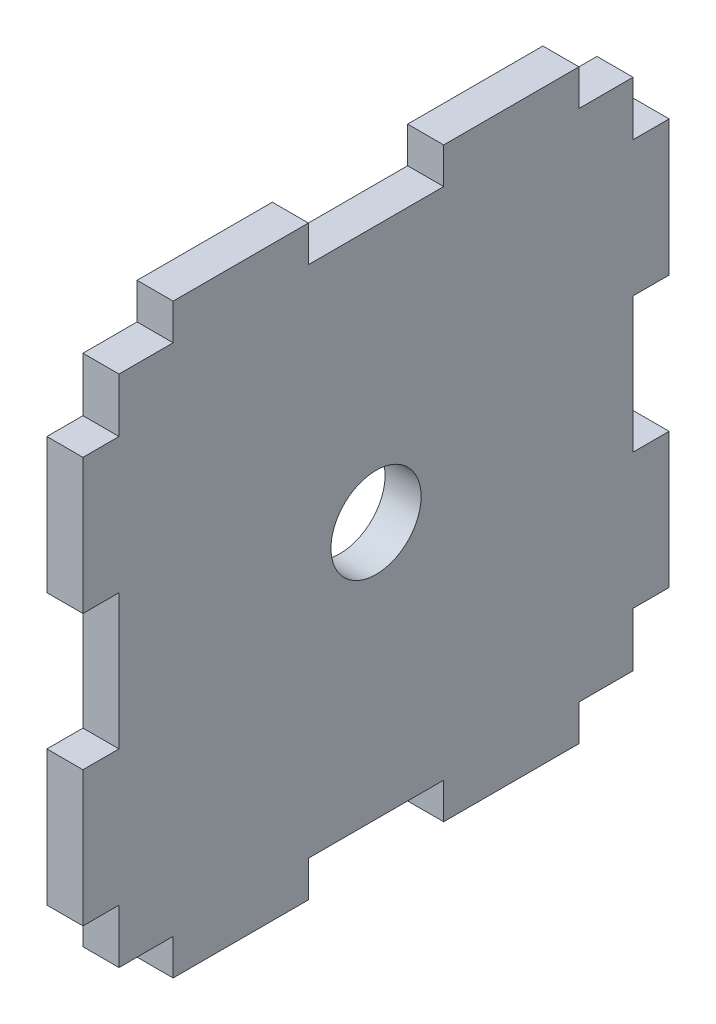
ISO-10303-21;
HEADER;
FILE_DESCRIPTION(('STEP AP214'),'2;1');
FILE_NAME('part.step','',(''),(''),'','','');
FILE_SCHEMA(('AUTOMOTIVE_DESIGN { 1 0 10303 214 1 1 1 1 }'));
ENDSEC;
DATA;
#1=APPLICATION_CONTEXT('core data for automotive mechanical design processes');
#2=APPLICATION_PROTOCOL_DEFINITION('international standard','automotive_design',2000,#1);
#3=PRODUCT_CONTEXT('',#1,'mechanical');
#4=PRODUCT('Part','Part','',(#3));
#5=PRODUCT_RELATED_PRODUCT_CATEGORY('part','',(#4));
#6=PRODUCT_DEFINITION_FORMATION('','',#4);
#7=PRODUCT_DEFINITION_CONTEXT('part definition',#1,'design');
#8=PRODUCT_DEFINITION('design','',#6,#7);
#9=PRODUCT_DEFINITION_SHAPE('','',#8);
#10=(LENGTH_UNIT() NAMED_UNIT(*) SI_UNIT(.MILLI.,.METRE.));
#11=(NAMED_UNIT(*) PLANE_ANGLE_UNIT() SI_UNIT($,.RADIAN.));
#12=(NAMED_UNIT(*) SI_UNIT($,.STERADIAN.) SOLID_ANGLE_UNIT());
#13=UNCERTAINTY_MEASURE_WITH_UNIT(LENGTH_MEASURE(1.E-05),#10,'distance_accuracy_value','');
#14=(GEOMETRIC_REPRESENTATION_CONTEXT(3) GLOBAL_UNCERTAINTY_ASSIGNED_CONTEXT((#13)) GLOBAL_UNIT_ASSIGNED_CONTEXT((#10,
#11,#12)) REPRESENTATION_CONTEXT('',''));
#15=CARTESIAN_POINT('',(0.,0.,0.));
#16=DIRECTION('',(0.,0.,1.));
#17=DIRECTION('',(1.,0.,0.));
#18=AXIS2_PLACEMENT_3D('',#15,#16,#17);
#19=CARTESIAN_POINT('',(4.,0.,0.));
#20=DIRECTION('',(0.,0.,-1.));
#21=DIRECTION('',(-1.,0.,0.));
#22=AXIS2_PLACEMENT_3D('',#19,#20,#21);
#23=PLANE('',#22);
#24=DIRECTION('',(0.,-1.,0.));
#25=VECTOR('',#24,1.);
#26=CARTESIAN_POINT('',(0.,0.,0.));
#27=LINE('',#26,#25);
#28=CARTESIAN_POINT('',(0.,25.,0.));
#29=VERTEX_POINT('',#28);
#30=CARTESIAN_POINT('',(0.,10.,0.));
#31=VERTEX_POINT('',#30);
#32=EDGE_CURVE('E518',#29,#31,#27,.T.);
#33=ORIENTED_EDGE('',*,*,#32,.T.);
#34=DIRECTION('',(1.,0.,0.));
#35=VECTOR('',#34,1.);
#36=CARTESIAN_POINT('',(0.,10.,0.));
#37=LINE('',#36,#35);
#38=CARTESIAN_POINT('',(4.,10.,0.));
#39=VERTEX_POINT('',#38);
#40=EDGE_CURVE('E299',#31,#39,#37,.T.);
#41=ORIENTED_EDGE('',*,*,#40,.T.);
#42=DIRECTION('',(0.,-1.,0.));
#43=VECTOR('',#42,1.);
#44=CARTESIAN_POINT('',(4.,0.,0.));
#45=LINE('',#44,#43);
#46=CARTESIAN_POINT('',(4.,25.,0.));
#47=VERTEX_POINT('',#46);
#48=EDGE_CURVE('E521',#47,#39,#45,.T.);
#49=ORIENTED_EDGE('',*,*,#48,.F.);
#50=DIRECTION('',(1.,0.,0.));
#51=VECTOR('',#50,1.);
#52=CARTESIAN_POINT('',(0.,25.,0.));
#53=LINE('',#52,#51);
#54=EDGE_CURVE('E304',#29,#47,#53,.T.);
#55=ORIENTED_EDGE('',*,*,#54,.F.);
#56=EDGE_LOOP('',(#33,#41,#49,#55));
#57=FACE_BOUND('',#56,.T.);
#58=ADVANCED_FACE('F35',(#57),#23,.F.);
#59=CARTESIAN_POINT('',(4.,0.,-65.));
#60=DIRECTION('',(0.,0.,1.));
#61=DIRECTION('',(1.,0.,0.));
#62=AXIS2_PLACEMENT_3D('',#59,#60,#61);
#63=PLANE('',#62);
#64=DIRECTION('',(0.,1.,0.));
#65=VECTOR('',#64,1.);
#66=CARTESIAN_POINT('',(0.,0.,-65.));
#67=LINE('',#66,#65);
#68=CARTESIAN_POINT('',(0.,40.,-65.));
#69=VERTEX_POINT('',#68);
#70=CARTESIAN_POINT('',(0.,55.,-65.));
#71=VERTEX_POINT('',#70);
#72=EDGE_CURVE('E541',#69,#71,#67,.T.);
#73=ORIENTED_EDGE('',*,*,#72,.T.);
#74=DIRECTION('',(1.,0.,0.));
#75=VECTOR('',#74,1.);
#76=CARTESIAN_POINT('',(0.,55.,-65.));
#77=LINE('',#76,#75);
#78=CARTESIAN_POINT('',(4.,55.,-65.));
#79=VERTEX_POINT('',#78);
#80=EDGE_CURVE('E356',#71,#79,#77,.T.);
#81=ORIENTED_EDGE('',*,*,#80,.T.);
#82=DIRECTION('',(0.,1.,0.));
#83=VECTOR('',#82,1.);
#84=CARTESIAN_POINT('',(4.,0.,-65.));
#85=LINE('',#84,#83);
#86=CARTESIAN_POINT('',(4.,40.,-65.));
#87=VERTEX_POINT('',#86);
#88=EDGE_CURVE('E530',#87,#79,#85,.T.);
#89=ORIENTED_EDGE('',*,*,#88,.F.);
#90=DIRECTION('',(1.,0.,0.));
#91=VECTOR('',#90,1.);
#92=CARTESIAN_POINT('',(0.,40.,-65.));
#93=LINE('',#92,#91);
#94=EDGE_CURVE('E336',#69,#87,#93,.T.);
#95=ORIENTED_EDGE('',*,*,#94,.F.);
#96=EDGE_LOOP('',(#73,#81,#89,#95));
#97=FACE_BOUND('',#96,.T.);
#98=ADVANCED_FACE('F595',(#97),#63,.F.);
#99=CARTESIAN_POINT('',(4.,0.,0.));
#100=DIRECTION('',(0.,1.,0.));
#101=DIRECTION('',(0.,0.,1.));
#102=AXIS2_PLACEMENT_3D('',#99,#100,#101);
#103=PLANE('',#102);
#104=DIRECTION('',(0.,0.,-1.));
#105=VECTOR('',#104,1.);
#106=CARTESIAN_POINT('',(4.,0.,0.));
#107=LINE('',#106,#105);
#108=CARTESIAN_POINT('',(4.,0.,-10.));
#109=VERTEX_POINT('',#108);
#110=CARTESIAN_POINT('',(4.,0.,-25.));
#111=VERTEX_POINT('',#110);
#112=EDGE_CURVE('E529',#109,#111,#107,.T.);
#113=ORIENTED_EDGE('',*,*,#112,.F.);
#114=DIRECTION('',(1.,0.,0.));
#115=VECTOR('',#114,1.);
#116=CARTESIAN_POINT('',(0.,0.,-10.));
#117=LINE('',#116,#115);
#118=CARTESIAN_POINT('',(0.,0.,-10.));
#119=VERTEX_POINT('',#118);
#120=EDGE_CURVE('E493',#119,#109,#117,.T.);
#121=ORIENTED_EDGE('',*,*,#120,.F.);
#122=DIRECTION('',(0.,0.,-1.));
#123=VECTOR('',#122,1.);
#124=CARTESIAN_POINT('',(0.,0.,0.));
#125=LINE('',#124,#123);
#126=CARTESIAN_POINT('',(0.,0.,-25.));
#127=VERTEX_POINT('',#126);
#128=EDGE_CURVE('E540',#119,#127,#125,.T.);
#129=ORIENTED_EDGE('',*,*,#128,.T.);
#130=DIRECTION('',(1.,0.,0.));
#131=VECTOR('',#130,1.);
#132=CARTESIAN_POINT('',(0.,0.,-25.));
#133=LINE('',#132,#131);
#134=EDGE_CURVE('E454',#127,#111,#133,.T.);
#135=ORIENTED_EDGE('',*,*,#134,.T.);
#136=EDGE_LOOP('',(#113,#121,#129,#135));
#137=FACE_BOUND('',#136,.T.);
#138=ADVANCED_FACE('F553',(#137),#103,.F.);
#139=CARTESIAN_POINT('',(4.,65.,0.));
#140=DIRECTION('',(0.,-1.,0.));
#141=DIRECTION('',(0.,0.,-1.));
#142=AXIS2_PLACEMENT_3D('',#139,#140,#141);
#143=PLANE('',#142);
#144=DIRECTION('',(0.,0.,1.));
#145=VECTOR('',#144,1.);
#146=CARTESIAN_POINT('',(4.,65.,0.));
#147=LINE('',#146,#145);
#148=CARTESIAN_POINT('',(4.,65.,-25.));
#149=VERTEX_POINT('',#148);
#150=CARTESIAN_POINT('',(4.,65.,-10.));
#151=VERTEX_POINT('',#150);
#152=EDGE_CURVE('E44',#149,#151,#147,.T.);
#153=ORIENTED_EDGE('',*,*,#152,.F.);
#154=DIRECTION('',(1.,0.,0.));
#155=VECTOR('',#154,1.);
#156=CARTESIAN_POINT('',(0.,65.,-25.));
#157=LINE('',#156,#155);
#158=CARTESIAN_POINT('',(0.,65.,-25.));
#159=VERTEX_POINT('',#158);
#160=EDGE_CURVE('E420',#159,#149,#157,.T.);
#161=ORIENTED_EDGE('',*,*,#160,.F.);
#162=DIRECTION('',(0.,0.,1.));
#163=VECTOR('',#162,1.);
#164=CARTESIAN_POINT('',(0.,65.,0.));
#165=LINE('',#164,#163);
#166=CARTESIAN_POINT('',(0.,65.,-10.));
#167=VERTEX_POINT('',#166);
#168=EDGE_CURVE('E39',#159,#167,#165,.T.);
#169=ORIENTED_EDGE('',*,*,#168,.T.);
#170=DIRECTION('',(1.,0.,0.));
#171=VECTOR('',#170,1.);
#172=CARTESIAN_POINT('',(0.,65.,-10.));
#173=LINE('',#172,#171);
#174=EDGE_CURVE('E509',#167,#151,#173,.T.);
#175=ORIENTED_EDGE('',*,*,#174,.T.);
#176=EDGE_LOOP('',(#153,#161,#169,#175));
#177=FACE_BOUND('',#176,.T.);
#178=ADVANCED_FACE('F603',(#177),#143,.F.);
#179=CARTESIAN_POINT('',(0.,55.,0.));
#180=VERTEX_POINT('',#179);
#181=CARTESIAN_POINT('',(0.,40.,0.));
#182=VERTEX_POINT('',#181);
#183=EDGE_CURVE('E537',#180,#182,#27,.T.);
#184=ORIENTED_EDGE('',*,*,#183,.T.);
#185=DIRECTION('',(1.,0.,0.));
#186=VECTOR('',#185,1.);
#187=CARTESIAN_POINT('',(0.,40.,0.));
#188=LINE('',#187,#186);
#189=CARTESIAN_POINT('',(4.,40.,0.));
#190=VERTEX_POINT('',#189);
#191=EDGE_CURVE('E60',#182,#190,#188,.T.);
#192=ORIENTED_EDGE('',*,*,#191,.T.);
#193=CARTESIAN_POINT('',(4.,55.,0.));
#194=VERTEX_POINT('',#193);
#195=EDGE_CURVE('E524',#194,#190,#45,.T.);
#196=ORIENTED_EDGE('',*,*,#195,.F.);
#197=DIRECTION('',(1.,0.,0.));
#198=VECTOR('',#197,1.);
#199=CARTESIAN_POINT('',(0.,55.,0.));
#200=LINE('',#199,#198);
#201=EDGE_CURVE('E390',#180,#194,#200,.T.);
#202=ORIENTED_EDGE('',*,*,#201,.F.);
#203=EDGE_LOOP('',(#184,#192,#196,#202));
#204=FACE_BOUND('',#203,.T.);
#205=ADVANCED_FACE('F37',(#204),#23,.F.);
#206=CARTESIAN_POINT('',(4.,0.,-40.));
#207=VERTEX_POINT('',#206);
#208=CARTESIAN_POINT('',(4.,0.,-55.));
#209=VERTEX_POINT('',#208);
#210=EDGE_CURVE('E526',#207,#209,#107,.T.);
#211=ORIENTED_EDGE('',*,*,#210,.F.);
#212=DIRECTION('',(1.,0.,0.));
#213=VECTOR('',#212,1.);
#214=CARTESIAN_POINT('',(0.,0.,-40.));
#215=LINE('',#214,#213);
#216=CARTESIAN_POINT('',(0.,0.,-40.));
#217=VERTEX_POINT('',#216);
#218=EDGE_CURVE('E470',#217,#207,#215,.T.);
#219=ORIENTED_EDGE('',*,*,#218,.F.);
#220=CARTESIAN_POINT('',(0.,0.,-55.));
#221=VERTEX_POINT('',#220);
#222=EDGE_CURVE('E538',#217,#221,#125,.T.);
#223=ORIENTED_EDGE('',*,*,#222,.T.);
#224=DIRECTION('',(1.,0.,0.));
#225=VECTOR('',#224,1.);
#226=CARTESIAN_POINT('',(0.,0.,-55.));
#227=LINE('',#226,#225);
#228=EDGE_CURVE('E440',#221,#209,#227,.T.);
#229=ORIENTED_EDGE('',*,*,#228,.T.);
#230=EDGE_LOOP('',(#211,#219,#223,#229));
#231=FACE_BOUND('',#230,.T.);
#232=ADVANCED_FACE('F602',(#231),#103,.F.);
#233=CARTESIAN_POINT('',(0.,10.,-65.));
#234=VERTEX_POINT('',#233);
#235=CARTESIAN_POINT('',(0.,25.,-65.));
#236=VERTEX_POINT('',#235);
#237=EDGE_CURVE('E543',#234,#236,#67,.T.);
#238=ORIENTED_EDGE('',*,*,#237,.T.);
#239=DIRECTION('',(1.,0.,0.));
#240=VECTOR('',#239,1.);
#241=CARTESIAN_POINT('',(0.,25.,-65.));
#242=LINE('',#241,#240);
#243=CARTESIAN_POINT('',(4.,25.,-65.));
#244=VERTEX_POINT('',#243);
#245=EDGE_CURVE('E361',#236,#244,#242,.T.);
#246=ORIENTED_EDGE('',*,*,#245,.T.);
#247=CARTESIAN_POINT('',(4.,10.,-65.));
#248=VERTEX_POINT('',#247);
#249=EDGE_CURVE('E532',#248,#244,#85,.T.);
#250=ORIENTED_EDGE('',*,*,#249,.F.);
#251=DIRECTION('',(1.,0.,0.));
#252=VECTOR('',#251,1.);
#253=CARTESIAN_POINT('',(0.,10.,-65.));
#254=LINE('',#253,#252);
#255=EDGE_CURVE('E318',#234,#248,#254,.T.);
#256=ORIENTED_EDGE('',*,*,#255,.F.);
#257=EDGE_LOOP('',(#238,#246,#250,#256));
#258=FACE_BOUND('',#257,.T.);
#259=ADVANCED_FACE('F600',(#258),#63,.F.);
#260=CARTESIAN_POINT('',(4.,65.,-55.));
#261=VERTEX_POINT('',#260);
#262=CARTESIAN_POINT('',(4.,65.,-40.));
#263=VERTEX_POINT('',#262);
#264=EDGE_CURVE('E11',#261,#263,#147,.T.);
#265=ORIENTED_EDGE('',*,*,#264,.F.);
#266=DIRECTION('',(1.,0.,0.));
#267=VECTOR('',#266,1.);
#268=CARTESIAN_POINT('',(0.,65.,-55.));
#269=LINE('',#268,#267);
#270=CARTESIAN_POINT('',(0.,65.,-55.));
#271=VERTEX_POINT('',#270);
#272=EDGE_CURVE('E436',#271,#261,#269,.T.);
#273=ORIENTED_EDGE('',*,*,#272,.F.);
#274=CARTESIAN_POINT('',(0.,65.,-40.));
#275=VERTEX_POINT('',#274);
#276=EDGE_CURVE('E525',#271,#275,#165,.T.);
#277=ORIENTED_EDGE('',*,*,#276,.T.);
#278=DIRECTION('',(1.,0.,0.));
#279=VECTOR('',#278,1.);
#280=CARTESIAN_POINT('',(0.,65.,-40.));
#281=LINE('',#280,#279);
#282=EDGE_CURVE('E423',#275,#263,#281,.T.);
#283=ORIENTED_EDGE('',*,*,#282,.T.);
#284=EDGE_LOOP('',(#265,#273,#277,#283));
#285=FACE_BOUND('',#284,.T.);
#286=ADVANCED_FACE('F612',(#285),#143,.F.);
#287=CARTESIAN_POINT('',(4.,0.,0.));
#288=DIRECTION('',(-1.,0.,0.));
#289=DIRECTION('',(0.,0.,1.));
#290=AXIS2_PLACEMENT_3D('',#287,#288,#289);
#291=PLANE('',#290);
#292=CARTESIAN_POINT('',(4.,32.5,-32.5));
#293=DIRECTION('',(1.,0.,0.));
#294=DIRECTION('',(0.,0.,-1.));
#295=AXIS2_PLACEMENT_3D('',#292,#293,#294);
#296=CIRCLE('',#295,5.);
#297=CARTESIAN_POINT('',(4.,32.5,-37.5));
#298=VERTEX_POINT('',#297);
#299=EDGE_CURVE('E512',#298,#298,#296,.T.);
#300=ORIENTED_EDGE('',*,*,#299,.F.);
#301=EDGE_LOOP('',(#300));
#302=FACE_BOUND('',#301,.T.);
#303=ORIENTED_EDGE('',*,*,#88,.T.);
#304=DIRECTION('',(0.,0.,-1.));
#305=VECTOR('',#304,1.);
#306=CARTESIAN_POINT('',(4.,55.,-65.));
#307=LINE('',#306,#305);
#308=CARTESIAN_POINT('',(4.,55.,-61.));
#309=VERTEX_POINT('',#308);
#310=EDGE_CURVE('E371',#309,#79,#307,.T.);
#311=ORIENTED_EDGE('',*,*,#310,.F.);
#312=DIRECTION('',(0.,-1.,0.));
#313=VECTOR('',#312,1.);
#314=CARTESIAN_POINT('',(4.,61.,-61.));
#315=LINE('',#314,#313);
#316=CARTESIAN_POINT('',(4.,61.,-61.));
#317=VERTEX_POINT('',#316);
#318=EDGE_CURVE('E374',#317,#309,#315,.T.);
#319=ORIENTED_EDGE('',*,*,#318,.F.);
#320=DIRECTION('',(0.,0.,-1.));
#321=VECTOR('',#320,1.);
#322=CARTESIAN_POINT('',(4.,61.,-65.));
#323=LINE('',#322,#321);
#324=CARTESIAN_POINT('',(4.,61.,-55.));
#325=VERTEX_POINT('',#324);
#326=EDGE_CURVE('E433',#325,#317,#323,.T.);
#327=ORIENTED_EDGE('',*,*,#326,.F.);
#328=DIRECTION('',(0.,-1.,0.));
#329=VECTOR('',#328,1.);
#330=CARTESIAN_POINT('',(4.,65.,-55.));
#331=LINE('',#330,#329);
#332=EDGE_CURVE('E437',#261,#325,#331,.T.);
#333=ORIENTED_EDGE('',*,*,#332,.F.);
#334=ORIENTED_EDGE('',*,*,#264,.T.);
#335=DIRECTION('',(0.,1.,0.));
#336=VECTOR('',#335,1.);
#337=CARTESIAN_POINT('',(4.,65.,-40.));
#338=LINE('',#337,#336);
#339=CARTESIAN_POINT('',(4.,61.,-40.));
#340=VERTEX_POINT('',#339);
#341=EDGE_CURVE('E405',#340,#263,#338,.T.);
#342=ORIENTED_EDGE('',*,*,#341,.F.);
#343=DIRECTION('',(0.,0.,-1.));
#344=VECTOR('',#343,1.);
#345=CARTESIAN_POINT('',(4.,61.,-25.));
#346=LINE('',#345,#344);
#347=CARTESIAN_POINT('',(4.,61.,-25.));
#348=VERTEX_POINT('',#347);
#349=EDGE_CURVE('E415',#348,#340,#346,.T.);
#350=ORIENTED_EDGE('',*,*,#349,.F.);
#351=DIRECTION('',(0.,-1.,0.));
#352=VECTOR('',#351,1.);
#353=CARTESIAN_POINT('',(4.,65.,-25.));
#354=LINE('',#353,#352);
#355=EDGE_CURVE('E412',#149,#348,#354,.T.);
#356=ORIENTED_EDGE('',*,*,#355,.F.);
#357=ORIENTED_EDGE('',*,*,#152,.T.);
#358=DIRECTION('',(0.,1.,0.));
#359=VECTOR('',#358,1.);
#360=CARTESIAN_POINT('',(4.,65.,-10.));
#361=LINE('',#360,#359);
#362=CARTESIAN_POINT('',(4.,61.,-10.));
#363=VERTEX_POINT('',#362);
#364=EDGE_CURVE('E503',#363,#151,#361,.T.);
#365=ORIENTED_EDGE('',*,*,#364,.F.);
#366=DIRECTION('',(0.,0.,-1.));
#367=VECTOR('',#366,1.);
#368=CARTESIAN_POINT('',(4.,61.,0.));
#369=LINE('',#368,#367);
#370=CARTESIAN_POINT('',(4.,61.,-4.));
#371=VERTEX_POINT('',#370);
#372=EDGE_CURVE('E422',#371,#363,#369,.T.);
#373=ORIENTED_EDGE('',*,*,#372,.F.);
#374=DIRECTION('',(0.,1.,0.));
#375=VECTOR('',#374,1.);
#376=CARTESIAN_POINT('',(4.,61.,-4.));
#377=LINE('',#376,#375);
#378=CARTESIAN_POINT('',(4.,55.,-4.));
#379=VERTEX_POINT('',#378);
#380=EDGE_CURVE('E387',#379,#371,#377,.T.);
#381=ORIENTED_EDGE('',*,*,#380,.F.);
#382=DIRECTION('',(0.,0.,-1.));
#383=VECTOR('',#382,1.);
#384=CARTESIAN_POINT('',(4.,55.,0.));
#385=LINE('',#384,#383);
#386=EDGE_CURVE('E303',#194,#379,#385,.T.);
#387=ORIENTED_EDGE('',*,*,#386,.F.);
#388=ORIENTED_EDGE('',*,*,#195,.T.);
#389=DIRECTION('',(0.,0.,1.));
#390=VECTOR('',#389,1.);
#391=CARTESIAN_POINT('',(4.,40.,-4.));
#392=LINE('',#391,#390);
#393=CARTESIAN_POINT('',(4.,40.,-4.));
#394=VERTEX_POINT('',#393);
#395=EDGE_CURVE('E294',#394,#190,#392,.T.);
#396=ORIENTED_EDGE('',*,*,#395,.F.);
#397=DIRECTION('',(0.,1.,0.));
#398=VECTOR('',#397,1.);
#399=CARTESIAN_POINT('',(4.,40.,-4.));
#400=LINE('',#399,#398);
#401=CARTESIAN_POINT('',(4.,25.,-4.00000000000001));
#402=VERTEX_POINT('',#401);
#403=EDGE_CURVE('E277',#402,#394,#400,.T.);
#404=ORIENTED_EDGE('',*,*,#403,.F.);
#405=DIRECTION('',(0.,0.,-1.));
#406=VECTOR('',#405,1.);
#407=CARTESIAN_POINT('',(4.,25.,-4.00000000000001));
#408=LINE('',#407,#406);
#409=EDGE_CURVE('E291',#47,#402,#408,.T.);
#410=ORIENTED_EDGE('',*,*,#409,.F.);
#411=ORIENTED_EDGE('',*,*,#48,.T.);
#412=DIRECTION('',(0.,0.,1.));
#413=VECTOR('',#412,1.);
#414=CARTESIAN_POINT('',(4.,10.,0.));
#415=LINE('',#414,#413);
#416=CARTESIAN_POINT('',(4.,10.,-4.));
#417=VERTEX_POINT('',#416);
#418=EDGE_CURVE('E311',#417,#39,#415,.T.);
#419=ORIENTED_EDGE('',*,*,#418,.F.);
#420=DIRECTION('',(0.,1.,0.));
#421=VECTOR('',#420,1.);
#422=CARTESIAN_POINT('',(4.,10.,-4.));
#423=LINE('',#422,#421);
#424=CARTESIAN_POINT('',(4.,4.00000000000002,-4.));
#425=VERTEX_POINT('',#424);
#426=EDGE_CURVE('E315',#425,#417,#423,.T.);
#427=ORIENTED_EDGE('',*,*,#426,.F.);
#428=DIRECTION('',(0.,0.,1.));
#429=VECTOR('',#428,1.);
#430=CARTESIAN_POINT('',(4.,4.00000000000002,0.));
#431=LINE('',#430,#429);
#432=CARTESIAN_POINT('',(4.,4.00000000000002,-10.));
#433=VERTEX_POINT('',#432);
#434=EDGE_CURVE('E490',#433,#425,#431,.T.);
#435=ORIENTED_EDGE('',*,*,#434,.F.);
#436=DIRECTION('',(0.,1.,0.));
#437=VECTOR('',#436,1.);
#438=CARTESIAN_POINT('',(4.,0.,-10.));
#439=LINE('',#438,#437);
#440=EDGE_CURVE('E397',#109,#433,#439,.T.);
#441=ORIENTED_EDGE('',*,*,#440,.F.);
#442=ORIENTED_EDGE('',*,*,#112,.T.);
#443=DIRECTION('',(0.,-1.,0.));
#444=VECTOR('',#443,1.);
#445=CARTESIAN_POINT('',(4.,0.,-25.));
#446=LINE('',#445,#444);
#447=CARTESIAN_POINT('',(4.,4.00000000000002,-25.));
#448=VERTEX_POINT('',#447);
#449=EDGE_CURVE('E464',#448,#111,#446,.T.);
#450=ORIENTED_EDGE('',*,*,#449,.F.);
#451=DIRECTION('',(0.,0.,1.));
#452=VECTOR('',#451,1.);
#453=CARTESIAN_POINT('',(4.,4.00000000000002,-25.));
#454=LINE('',#453,#452);
#455=CARTESIAN_POINT('',(4.,4.00000000000002,-40.));
#456=VERTEX_POINT('',#455);
#457=EDGE_CURVE('E474',#456,#448,#454,.T.);
#458=ORIENTED_EDGE('',*,*,#457,.F.);
#459=DIRECTION('',(0.,1.,0.));
#460=VECTOR('',#459,1.);
#461=CARTESIAN_POINT('',(4.,0.,-40.));
#462=LINE('',#461,#460);
#463=EDGE_CURVE('E471',#207,#456,#462,.T.);
#464=ORIENTED_EDGE('',*,*,#463,.F.);
#465=ORIENTED_EDGE('',*,*,#210,.T.);
#466=DIRECTION('',(0.,-1.,0.));
#467=VECTOR('',#466,1.);
#468=CARTESIAN_POINT('',(4.,0.,-55.));
#469=LINE('',#468,#467);
#470=CARTESIAN_POINT('',(4.,4.00000000000002,-55.));
#471=VERTEX_POINT('',#470);
#472=EDGE_CURVE('E448',#471,#209,#469,.T.);
#473=ORIENTED_EDGE('',*,*,#472,.F.);
#474=DIRECTION('',(0.,0.,1.));
#475=VECTOR('',#474,1.);
#476=CARTESIAN_POINT('',(4.,4.00000000000002,-65.));
#477=LINE('',#476,#475);
#478=CARTESIAN_POINT('',(4.,4.00000000000002,-61.));
#479=VERTEX_POINT('',#478);
#480=EDGE_CURVE('E452',#479,#471,#477,.T.);
#481=ORIENTED_EDGE('',*,*,#480,.F.);
#482=DIRECTION('',(0.,-1.,0.));
#483=VECTOR('',#482,1.);
#484=CARTESIAN_POINT('',(4.,10.,-61.));
#485=LINE('',#484,#483);
#486=CARTESIAN_POINT('',(4.,10.,-61.));
#487=VERTEX_POINT('',#486);
#488=EDGE_CURVE('E329',#487,#479,#485,.T.);
#489=ORIENTED_EDGE('',*,*,#488,.F.);
#490=DIRECTION('',(0.,0.,1.));
#491=VECTOR('',#490,1.);
#492=CARTESIAN_POINT('',(4.,10.,-65.));
#493=LINE('',#492,#491);
#494=EDGE_CURVE('E333',#248,#487,#493,.T.);
#495=ORIENTED_EDGE('',*,*,#494,.F.);
#496=ORIENTED_EDGE('',*,*,#249,.T.);
#497=DIRECTION('',(0.,0.,-1.));
#498=VECTOR('',#497,1.);
#499=CARTESIAN_POINT('',(4.,25.,-61.));
#500=LINE('',#499,#498);
#501=CARTESIAN_POINT('',(4.,25.,-61.));
#502=VERTEX_POINT('',#501);
#503=EDGE_CURVE('E347',#502,#244,#500,.T.);
#504=ORIENTED_EDGE('',*,*,#503,.F.);
#505=DIRECTION('',(0.,-1.,0.));
#506=VECTOR('',#505,1.);
#507=CARTESIAN_POINT('',(4.,40.,-61.));
#508=LINE('',#507,#506);
#509=CARTESIAN_POINT('',(4.,40.,-61.));
#510=VERTEX_POINT('',#509);
#511=EDGE_CURVE('E355',#510,#502,#508,.T.);
#512=ORIENTED_EDGE('',*,*,#511,.F.);
#513=DIRECTION('',(0.,0.,1.));
#514=VECTOR('',#513,1.);
#515=CARTESIAN_POINT('',(4.,40.,-61.));
#516=LINE('',#515,#514);
#517=EDGE_CURVE('E352',#87,#510,#516,.T.);
#518=ORIENTED_EDGE('',*,*,#517,.F.);
#519=EDGE_LOOP('',(#303,#311,#319,#327,#333,#334,#342,#350,#356,#357,#365,#373,#381,#387,#388,
#396,#404,#410,#411,#419,#427,#435,#441,#442,#450,#458,#464,#465,#473,#481,#489,#495,#496,#504,
#512,#518));
#520=FACE_BOUND('',#519,.T.);
#521=ADVANCED_FACE('F561',(#302,#520),#291,.F.);
#522=CARTESIAN_POINT('',(0.,0.,0.));
#523=DIRECTION('',(-1.,0.,0.));
#524=DIRECTION('',(0.,0.,1.));
#525=AXIS2_PLACEMENT_3D('',#522,#523,#524);
#526=PLANE('',#525);
#527=DIRECTION('',(0.,0.,-1.));
#528=VECTOR('',#527,1.);
#529=CARTESIAN_POINT('',(0.,55.,-65.));
#530=LINE('',#529,#528);
#531=CARTESIAN_POINT('',(0.,55.,-61.));
#532=VERTEX_POINT('',#531);
#533=EDGE_CURVE('E370',#532,#71,#530,.T.);
#534=ORIENTED_EDGE('',*,*,#533,.T.);
#535=ORIENTED_EDGE('',*,*,#72,.F.);
#536=DIRECTION('',(0.,0.,1.));
#537=VECTOR('',#536,1.);
#538=CARTESIAN_POINT('',(0.,40.,-61.));
#539=LINE('',#538,#537);
#540=CARTESIAN_POINT('',(0.,40.,-61.));
#541=VERTEX_POINT('',#540);
#542=EDGE_CURVE('E343',#69,#541,#539,.T.);
#543=ORIENTED_EDGE('',*,*,#542,.T.);
#544=DIRECTION('',(0.,-1.,0.));
#545=VECTOR('',#544,1.);
#546=CARTESIAN_POINT('',(0.,40.,-61.));
#547=LINE('',#546,#545);
#548=CARTESIAN_POINT('',(0.,25.,-61.));
#549=VERTEX_POINT('',#548);
#550=EDGE_CURVE('E346',#541,#549,#547,.T.);
#551=ORIENTED_EDGE('',*,*,#550,.T.);
#552=DIRECTION('',(0.,0.,-1.));
#553=VECTOR('',#552,1.);
#554=CARTESIAN_POINT('',(0.,25.,-61.));
#555=LINE('',#554,#553);
#556=EDGE_CURVE('E52',#549,#236,#555,.T.);
#557=ORIENTED_EDGE('',*,*,#556,.T.);
#558=ORIENTED_EDGE('',*,*,#237,.F.);
#559=DIRECTION('',(0.,0.,1.));
#560=VECTOR('',#559,1.);
#561=CARTESIAN_POINT('',(0.,10.,-65.));
#562=LINE('',#561,#560);
#563=CARTESIAN_POINT('',(0.,10.,-61.));
#564=VERTEX_POINT('',#563);
#565=EDGE_CURVE('E325',#234,#564,#562,.T.);
#566=ORIENTED_EDGE('',*,*,#565,.T.);
#567=DIRECTION('',(0.,-1.,0.));
#568=VECTOR('',#567,1.);
#569=CARTESIAN_POINT('',(0.,10.,-61.));
#570=LINE('',#569,#568);
#571=CARTESIAN_POINT('',(0.,4.00000000000002,-61.));
#572=VERTEX_POINT('',#571);
#573=EDGE_CURVE('E328',#564,#572,#570,.T.);
#574=ORIENTED_EDGE('',*,*,#573,.T.);
#575=DIRECTION('',(0.,0.,1.));
#576=VECTOR('',#575,1.);
#577=CARTESIAN_POINT('',(0.,4.00000000000002,-65.));
#578=LINE('',#577,#576);
#579=CARTESIAN_POINT('',(0.,4.00000000000002,-55.));
#580=VERTEX_POINT('',#579);
#581=EDGE_CURVE('E445',#572,#580,#578,.T.);
#582=ORIENTED_EDGE('',*,*,#581,.T.);
#583=DIRECTION('',(0.,-1.,0.));
#584=VECTOR('',#583,1.);
#585=CARTESIAN_POINT('',(0.,0.,-55.));
#586=LINE('',#585,#584);
#587=EDGE_CURVE('E447',#580,#221,#586,.T.);
#588=ORIENTED_EDGE('',*,*,#587,.T.);
#589=ORIENTED_EDGE('',*,*,#222,.F.);
#590=DIRECTION('',(0.,1.,0.));
#591=VECTOR('',#590,1.);
#592=CARTESIAN_POINT('',(0.,0.,-40.));
#593=LINE('',#592,#591);
#594=CARTESIAN_POINT('',(0.,4.00000000000002,-40.));
#595=VERTEX_POINT('',#594);
#596=EDGE_CURVE('E460',#217,#595,#593,.T.);
#597=ORIENTED_EDGE('',*,*,#596,.T.);
#598=DIRECTION('',(0.,0.,1.));
#599=VECTOR('',#598,1.);
#600=CARTESIAN_POINT('',(0.,4.00000000000002,-25.));
#601=LINE('',#600,#599);
#602=CARTESIAN_POINT('',(0.,4.00000000000002,-25.));
#603=VERTEX_POINT('',#602);
#604=EDGE_CURVE('E463',#595,#603,#601,.T.);
#605=ORIENTED_EDGE('',*,*,#604,.T.);
#606=DIRECTION('',(0.,-1.,0.));
#607=VECTOR('',#606,1.);
#608=CARTESIAN_POINT('',(0.,0.,-25.));
#609=LINE('',#608,#607);
#610=EDGE_CURVE('E467',#603,#127,#609,.T.);
#611=ORIENTED_EDGE('',*,*,#610,.T.);
#612=ORIENTED_EDGE('',*,*,#128,.F.);
#613=DIRECTION('',(0.,1.,0.));
#614=VECTOR('',#613,1.);
#615=CARTESIAN_POINT('',(0.,0.,-10.));
#616=LINE('',#615,#614);
#617=CARTESIAN_POINT('',(0.,4.00000000000002,-10.));
#618=VERTEX_POINT('',#617);
#619=EDGE_CURVE('E486',#119,#618,#616,.T.);
#620=ORIENTED_EDGE('',*,*,#619,.T.);
#621=DIRECTION('',(0.,0.,1.));
#622=VECTOR('',#621,1.);
#623=CARTESIAN_POINT('',(0.,4.00000000000002,0.));
#624=LINE('',#623,#622);
#625=CARTESIAN_POINT('',(0.,4.00000000000002,-4.));
#626=VERTEX_POINT('',#625);
#627=EDGE_CURVE('E489',#618,#626,#624,.T.);
#628=ORIENTED_EDGE('',*,*,#627,.T.);
#629=DIRECTION('',(0.,1.,0.));
#630=VECTOR('',#629,1.);
#631=CARTESIAN_POINT('',(0.,10.,-4.));
#632=LINE('',#631,#630);
#633=CARTESIAN_POINT('',(0.,10.,-4.));
#634=VERTEX_POINT('',#633);
#635=EDGE_CURVE('E307',#626,#634,#632,.T.);
#636=ORIENTED_EDGE('',*,*,#635,.T.);
#637=DIRECTION('',(0.,0.,1.));
#638=VECTOR('',#637,1.);
#639=CARTESIAN_POINT('',(0.,10.,0.));
#640=LINE('',#639,#638);
#641=EDGE_CURVE('E310',#634,#31,#640,.T.);
#642=ORIENTED_EDGE('',*,*,#641,.T.);
#643=ORIENTED_EDGE('',*,*,#32,.F.);
#644=DIRECTION('',(0.,0.,-1.));
#645=VECTOR('',#644,1.);
#646=CARTESIAN_POINT('',(0.,25.,-4.00000000000001));
#647=LINE('',#646,#645);
#648=CARTESIAN_POINT('',(0.,25.,-4.00000000000001));
#649=VERTEX_POINT('',#648);
#650=EDGE_CURVE('E279',#29,#649,#647,.T.);
#651=ORIENTED_EDGE('',*,*,#650,.T.);
#652=DIRECTION('',(0.,1.,0.));
#653=VECTOR('',#652,1.);
#654=CARTESIAN_POINT('',(0.,40.,-4.));
#655=LINE('',#654,#653);
#656=CARTESIAN_POINT('',(0.,40.,-4.));
#657=VERTEX_POINT('',#656);
#658=EDGE_CURVE('E274',#649,#657,#655,.T.);
#659=ORIENTED_EDGE('',*,*,#658,.T.);
#660=DIRECTION('',(0.,0.,1.));
#661=VECTOR('',#660,1.);
#662=CARTESIAN_POINT('',(0.,40.,-4.));
#663=LINE('',#662,#661);
#664=EDGE_CURVE('E281',#657,#182,#663,.T.);
#665=ORIENTED_EDGE('',*,*,#664,.T.);
#666=ORIENTED_EDGE('',*,*,#183,.F.);
#667=DIRECTION('',(0.,0.,-1.));
#668=VECTOR('',#667,1.);
#669=CARTESIAN_POINT('',(0.,55.,0.));
#670=LINE('',#669,#668);
#671=CARTESIAN_POINT('',(0.,55.,-4.));
#672=VERTEX_POINT('',#671);
#673=EDGE_CURVE('E383',#180,#672,#670,.T.);
#674=ORIENTED_EDGE('',*,*,#673,.T.);
#675=DIRECTION('',(0.,1.,0.));
#676=VECTOR('',#675,1.);
#677=CARTESIAN_POINT('',(0.,61.,-4.));
#678=LINE('',#677,#676);
#679=CARTESIAN_POINT('',(0.,61.,-4.));
#680=VERTEX_POINT('',#679);
#681=EDGE_CURVE('E386',#672,#680,#678,.T.);
#682=ORIENTED_EDGE('',*,*,#681,.T.);
#683=DIRECTION('',(0.,0.,-1.));
#684=VECTOR('',#683,1.);
#685=CARTESIAN_POINT('',(0.,61.,0.));
#686=LINE('',#685,#684);
#687=CARTESIAN_POINT('',(0.,61.,-10.));
#688=VERTEX_POINT('',#687);
#689=EDGE_CURVE('E500',#680,#688,#686,.T.);
#690=ORIENTED_EDGE('',*,*,#689,.T.);
#691=DIRECTION('',(0.,1.,0.));
#692=VECTOR('',#691,1.);
#693=CARTESIAN_POINT('',(0.,65.,-10.));
#694=LINE('',#693,#692);
#695=EDGE_CURVE('E502',#688,#167,#694,.T.);
#696=ORIENTED_EDGE('',*,*,#695,.T.);
#697=ORIENTED_EDGE('',*,*,#168,.F.);
#698=DIRECTION('',(0.,-1.,0.));
#699=VECTOR('',#698,1.);
#700=CARTESIAN_POINT('',(0.,65.,-25.));
#701=LINE('',#700,#699);
#702=CARTESIAN_POINT('',(0.,61.,-25.));
#703=VERTEX_POINT('',#702);
#704=EDGE_CURVE('E401',#159,#703,#701,.T.);
#705=ORIENTED_EDGE('',*,*,#704,.T.);
#706=DIRECTION('',(0.,0.,-1.));
#707=VECTOR('',#706,1.);
#708=CARTESIAN_POINT('',(0.,61.,-25.));
#709=LINE('',#708,#707);
#710=CARTESIAN_POINT('',(0.,61.,-40.));
#711=VERTEX_POINT('',#710);
#712=EDGE_CURVE('E404',#703,#711,#709,.T.);
#713=ORIENTED_EDGE('',*,*,#712,.T.);
#714=DIRECTION('',(0.,1.,0.));
#715=VECTOR('',#714,1.);
#716=CARTESIAN_POINT('',(0.,65.,-40.));
#717=LINE('',#716,#715);
#718=EDGE_CURVE('E408',#711,#275,#717,.T.);
#719=ORIENTED_EDGE('',*,*,#718,.T.);
#720=ORIENTED_EDGE('',*,*,#276,.F.);
#721=DIRECTION('',(0.,-1.,0.));
#722=VECTOR('',#721,1.);
#723=CARTESIAN_POINT('',(0.,65.,-55.));
#724=LINE('',#723,#722);
#725=CARTESIAN_POINT('',(0.,61.,-55.));
#726=VERTEX_POINT('',#725);
#727=EDGE_CURVE('E429',#271,#726,#724,.T.);
#728=ORIENTED_EDGE('',*,*,#727,.T.);
#729=DIRECTION('',(0.,0.,-1.));
#730=VECTOR('',#729,1.);
#731=CARTESIAN_POINT('',(0.,61.,-65.));
#732=LINE('',#731,#730);
#733=CARTESIAN_POINT('',(0.,61.,-61.));
#734=VERTEX_POINT('',#733);
#735=EDGE_CURVE('E432',#726,#734,#732,.T.);
#736=ORIENTED_EDGE('',*,*,#735,.T.);
#737=DIRECTION('',(0.,-1.,0.));
#738=VECTOR('',#737,1.);
#739=CARTESIAN_POINT('',(0.,61.,-61.));
#740=LINE('',#739,#738);
#741=EDGE_CURVE('E367',#734,#532,#740,.T.);
#742=ORIENTED_EDGE('',*,*,#741,.T.);
#743=EDGE_LOOP('',(#534,#535,#543,#551,#557,#558,#566,#574,#582,#588,#589,#597,#605,#611,#612,
#620,#628,#636,#642,#643,#651,#659,#665,#666,#674,#682,#690,#696,#697,#705,#713,#719,#720,#728,
#736,#742));
#744=FACE_BOUND('',#743,.T.);
#745=CARTESIAN_POINT('',(0.,32.5,-32.5));
#746=DIRECTION('',(1.,0.,0.));
#747=DIRECTION('',(0.,0.,-1.));
#748=AXIS2_PLACEMENT_3D('',#745,#746,#747);
#749=CIRCLE('',#748,5.);
#750=CARTESIAN_POINT('',(0.,32.5,-37.5));
#751=VERTEX_POINT('',#750);
#752=EDGE_CURVE('E515',#751,#751,#749,.T.);
#753=ORIENTED_EDGE('',*,*,#752,.T.);
#754=EDGE_LOOP('',(#753));
#755=FACE_BOUND('',#754,.T.);
#756=ADVANCED_FACE('F288',(#744,#755),#526,.T.);
#757=CARTESIAN_POINT('',(0.,32.5,-32.5));
#758=DIRECTION('',(1.,0.,0.));
#759=DIRECTION('',(0.,0.,-1.));
#760=AXIS2_PLACEMENT_3D('',#757,#758,#759);
#761=CYLINDRICAL_SURFACE('',#760,5.);
#762=ORIENTED_EDGE('',*,*,#752,.F.);
#763=EDGE_LOOP('',(#762));
#764=FACE_BOUND('',#763,.T.);
#765=ORIENTED_EDGE('',*,*,#299,.T.);
#766=EDGE_LOOP('',(#765));
#767=FACE_BOUND('',#766,.T.);
#768=ADVANCED_FACE('F717',(#764,#767),#761,.F.);
#769=CARTESIAN_POINT('',(0.,65.,-10.));
#770=DIRECTION('',(0.,0.,-1.));
#771=DIRECTION('',(0.,1.,0.));
#772=AXIS2_PLACEMENT_3D('',#769,#770,#771);
#773=PLANE('',#772);
#774=ORIENTED_EDGE('',*,*,#364,.T.);
#775=ORIENTED_EDGE('',*,*,#174,.F.);
#776=ORIENTED_EDGE('',*,*,#695,.F.);
#777=DIRECTION('',(1.,0.,0.));
#778=VECTOR('',#777,1.);
#779=CARTESIAN_POINT('',(0.,61.,-10.));
#780=LINE('',#779,#778);
#781=EDGE_CURVE('E506',#688,#363,#780,.T.);
#782=ORIENTED_EDGE('',*,*,#781,.T.);
#783=EDGE_LOOP('',(#774,#775,#776,#782));
#784=FACE_BOUND('',#783,.T.);
#785=ADVANCED_FACE('F631',(#784),#773,.F.);
#786=CARTESIAN_POINT('',(0.,61.,0.));
#787=DIRECTION('',(0.,-1.,0.));
#788=DIRECTION('',(0.,0.,-1.));
#789=AXIS2_PLACEMENT_3D('',#786,#787,#788);
#790=PLANE('',#789);
#791=ORIENTED_EDGE('',*,*,#689,.F.);
#792=DIRECTION('',(1.,0.,0.));
#793=VECTOR('',#792,1.);
#794=CARTESIAN_POINT('',(0.,61.,-4.));
#795=LINE('',#794,#793);
#796=EDGE_CURVE('E394',#680,#371,#795,.T.);
#797=ORIENTED_EDGE('',*,*,#796,.T.);
#798=ORIENTED_EDGE('',*,*,#372,.T.);
#799=ORIENTED_EDGE('',*,*,#781,.F.);
#800=EDGE_LOOP('',(#791,#797,#798,#799));
#801=FACE_BOUND('',#800,.T.);
#802=ADVANCED_FACE('F625',(#801),#790,.F.);
#803=CARTESIAN_POINT('',(0.,65.,-25.));
#804=DIRECTION('',(0.,0.,1.));
#805=DIRECTION('',(0.,-1.,0.));
#806=AXIS2_PLACEMENT_3D('',#803,#804,#805);
#807=PLANE('',#806);
#808=ORIENTED_EDGE('',*,*,#355,.T.);
#809=DIRECTION('',(1.,0.,0.));
#810=VECTOR('',#809,1.);
#811=CARTESIAN_POINT('',(0.,61.,-25.));
#812=LINE('',#811,#810);
#813=EDGE_CURVE('E411',#703,#348,#812,.T.);
#814=ORIENTED_EDGE('',*,*,#813,.F.);
#815=ORIENTED_EDGE('',*,*,#704,.F.);
#816=ORIENTED_EDGE('',*,*,#160,.T.);
#817=EDGE_LOOP('',(#808,#814,#815,#816));
#818=FACE_BOUND('',#817,.T.);
#819=ADVANCED_FACE('F720',(#818),#807,.F.);
#820=CARTESIAN_POINT('',(0.,65.,-40.));
#821=DIRECTION('',(0.,0.,-1.));
#822=DIRECTION('',(-1.,0.,0.));
#823=AXIS2_PLACEMENT_3D('',#820,#821,#822);
#824=PLANE('',#823);
#825=ORIENTED_EDGE('',*,*,#341,.T.);
#826=ORIENTED_EDGE('',*,*,#282,.F.);
#827=ORIENTED_EDGE('',*,*,#718,.F.);
#828=DIRECTION('',(1.,0.,0.));
#829=VECTOR('',#828,1.);
#830=CARTESIAN_POINT('',(0.,61.,-40.));
#831=LINE('',#830,#829);
#832=EDGE_CURVE('E426',#711,#340,#831,.T.);
#833=ORIENTED_EDGE('',*,*,#832,.T.);
#834=EDGE_LOOP('',(#825,#826,#827,#833));
#835=FACE_BOUND('',#834,.T.);
#836=ADVANCED_FACE('F644',(#835),#824,.F.);
#837=CARTESIAN_POINT('',(0.,61.,-25.));
#838=DIRECTION('',(0.,-1.,0.));
#839=DIRECTION('',(0.,0.,-1.));
#840=AXIS2_PLACEMENT_3D('',#837,#838,#839);
#841=PLANE('',#840);
#842=ORIENTED_EDGE('',*,*,#349,.T.);
#843=ORIENTED_EDGE('',*,*,#832,.F.);
#844=ORIENTED_EDGE('',*,*,#712,.F.);
#845=ORIENTED_EDGE('',*,*,#813,.T.);
#846=EDGE_LOOP('',(#842,#843,#844,#845));
#847=FACE_BOUND('',#846,.T.);
#848=ADVANCED_FACE('F646',(#847),#841,.F.);
#849=CARTESIAN_POINT('',(0.,61.,-65.));
#850=DIRECTION('',(0.,-1.,0.));
#851=DIRECTION('',(0.,0.,-1.));
#852=AXIS2_PLACEMENT_3D('',#849,#850,#851);
#853=PLANE('',#852);
#854=ORIENTED_EDGE('',*,*,#326,.T.);
#855=DIRECTION('',(1.,0.,0.));
#856=VECTOR('',#855,1.);
#857=CARTESIAN_POINT('',(0.,61.,-61.));
#858=LINE('',#857,#856);
#859=EDGE_CURVE('E373',#734,#317,#858,.T.);
#860=ORIENTED_EDGE('',*,*,#859,.F.);
#861=ORIENTED_EDGE('',*,*,#735,.F.);
#862=DIRECTION('',(1.,0.,0.));
#863=VECTOR('',#862,1.);
#864=CARTESIAN_POINT('',(0.,61.,-55.));
#865=LINE('',#864,#863);
#866=EDGE_CURVE('E416',#726,#325,#865,.T.);
#867=ORIENTED_EDGE('',*,*,#866,.T.);
#868=EDGE_LOOP('',(#854,#860,#861,#867));
#869=FACE_BOUND('',#868,.T.);
#870=ADVANCED_FACE('F656',(#869),#853,.F.);
#871=CARTESIAN_POINT('',(0.,65.,-55.));
#872=DIRECTION('',(0.,0.,1.));
#873=DIRECTION('',(1.,0.,0.));
#874=AXIS2_PLACEMENT_3D('',#871,#872,#873);
#875=PLANE('',#874);
#876=ORIENTED_EDGE('',*,*,#332,.T.);
#877=ORIENTED_EDGE('',*,*,#866,.F.);
#878=ORIENTED_EDGE('',*,*,#727,.F.);
#879=ORIENTED_EDGE('',*,*,#272,.T.);
#880=EDGE_LOOP('',(#876,#877,#878,#879));
#881=FACE_BOUND('',#880,.T.);
#882=ADVANCED_FACE('F654',(#881),#875,.F.);
#883=CARTESIAN_POINT('',(0.,0.,-55.));
#884=DIRECTION('',(0.,0.,1.));
#885=DIRECTION('',(1.,0.,0.));
#886=AXIS2_PLACEMENT_3D('',#883,#884,#885);
#887=PLANE('',#886);
#888=ORIENTED_EDGE('',*,*,#472,.T.);
#889=ORIENTED_EDGE('',*,*,#228,.F.);
#890=ORIENTED_EDGE('',*,*,#587,.F.);
#891=DIRECTION('',(1.,0.,0.));
#892=VECTOR('',#891,1.);
#893=CARTESIAN_POINT('',(0.,4.00000000000002,-55.));
#894=LINE('',#893,#892);
#895=EDGE_CURVE('E451',#580,#471,#894,.T.);
#896=ORIENTED_EDGE('',*,*,#895,.T.);
#897=EDGE_LOOP('',(#888,#889,#890,#896));
#898=FACE_BOUND('',#897,.T.);
#899=ADVANCED_FACE('F692',(#898),#887,.F.);
#900=CARTESIAN_POINT('',(0.,4.00000000000002,-65.));
#901=DIRECTION('',(0.,1.,0.));
#902=DIRECTION('',(0.,0.,1.));
#903=AXIS2_PLACEMENT_3D('',#900,#901,#902);
#904=PLANE('',#903);
#905=ORIENTED_EDGE('',*,*,#581,.F.);
#906=DIRECTION('',(1.,0.,0.));
#907=VECTOR('',#906,1.);
#908=CARTESIAN_POINT('',(0.,4.00000000000002,-61.));
#909=LINE('',#908,#907);
#910=EDGE_CURVE('E339',#572,#479,#909,.T.);
#911=ORIENTED_EDGE('',*,*,#910,.T.);
#912=ORIENTED_EDGE('',*,*,#480,.T.);
#913=ORIENTED_EDGE('',*,*,#895,.F.);
#914=EDGE_LOOP('',(#905,#911,#912,#913));
#915=FACE_BOUND('',#914,.T.);
#916=ADVANCED_FACE('F689',(#915),#904,.F.);
#917=CARTESIAN_POINT('',(0.,0.,-25.));
#918=DIRECTION('',(0.,0.,1.));
#919=DIRECTION('',(0.,-1.,0.));
#920=AXIS2_PLACEMENT_3D('',#917,#918,#919);
#921=PLANE('',#920);
#922=ORIENTED_EDGE('',*,*,#449,.T.);
#923=ORIENTED_EDGE('',*,*,#134,.F.);
#924=ORIENTED_EDGE('',*,*,#610,.F.);
#925=DIRECTION('',(1.,0.,0.));
#926=VECTOR('',#925,1.);
#927=CARTESIAN_POINT('',(0.,4.00000000000002,-25.));
#928=LINE('',#927,#926);
#929=EDGE_CURVE('E481',#603,#448,#928,.T.);
#930=ORIENTED_EDGE('',*,*,#929,.T.);
#931=EDGE_LOOP('',(#922,#923,#924,#930));
#932=FACE_BOUND('',#931,.T.);
#933=ADVANCED_FACE('F557',(#932),#921,.F.);
#934=CARTESIAN_POINT('',(0.,4.00000000000002,-25.));
#935=DIRECTION('',(0.,1.,0.));
#936=DIRECTION('',(0.,0.,1.));
#937=AXIS2_PLACEMENT_3D('',#934,#935,#936);
#938=PLANE('',#937);
#939=ORIENTED_EDGE('',*,*,#457,.T.);
#940=ORIENTED_EDGE('',*,*,#929,.F.);
#941=ORIENTED_EDGE('',*,*,#604,.F.);
#942=DIRECTION('',(1.,0.,0.));
#943=VECTOR('',#942,1.);
#944=CARTESIAN_POINT('',(0.,4.00000000000002,-40.));
#945=LINE('',#944,#943);
#946=EDGE_CURVE('E483',#595,#456,#945,.T.);
#947=ORIENTED_EDGE('',*,*,#946,.T.);
#948=EDGE_LOOP('',(#939,#940,#941,#947));
#949=FACE_BOUND('',#948,.T.);
#950=ADVANCED_FACE('F700',(#949),#938,.F.);
#951=CARTESIAN_POINT('',(0.,0.,-40.));
#952=DIRECTION('',(0.,0.,-1.));
#953=DIRECTION('',(-1.,0.,0.));
#954=AXIS2_PLACEMENT_3D('',#951,#952,#953);
#955=PLANE('',#954);
#956=ORIENTED_EDGE('',*,*,#463,.T.);
#957=ORIENTED_EDGE('',*,*,#946,.F.);
#958=ORIENTED_EDGE('',*,*,#596,.F.);
#959=ORIENTED_EDGE('',*,*,#218,.T.);
#960=EDGE_LOOP('',(#956,#957,#958,#959));
#961=FACE_BOUND('',#960,.T.);
#962=ADVANCED_FACE('F698',(#961),#955,.F.);
#963=CARTESIAN_POINT('',(0.,4.00000000000002,0.));
#964=DIRECTION('',(0.,1.,0.));
#965=DIRECTION('',(0.,0.,1.));
#966=AXIS2_PLACEMENT_3D('',#963,#964,#965);
#967=PLANE('',#966);
#968=ORIENTED_EDGE('',*,*,#434,.T.);
#969=DIRECTION('',(1.,0.,0.));
#970=VECTOR('',#969,1.);
#971=CARTESIAN_POINT('',(0.,4.00000000000002,-4.));
#972=LINE('',#971,#970);
#973=EDGE_CURVE('E314',#626,#425,#972,.T.);
#974=ORIENTED_EDGE('',*,*,#973,.F.);
#975=ORIENTED_EDGE('',*,*,#627,.F.);
#976=DIRECTION('',(1.,0.,0.));
#977=VECTOR('',#976,1.);
#978=CARTESIAN_POINT('',(0.,4.00000000000002,-10.));
#979=LINE('',#978,#977);
#980=EDGE_CURVE('E475',#618,#433,#979,.T.);
#981=ORIENTED_EDGE('',*,*,#980,.T.);
#982=EDGE_LOOP('',(#968,#974,#975,#981));
#983=FACE_BOUND('',#982,.T.);
#984=ADVANCED_FACE('F570',(#983),#967,.F.);
#985=CARTESIAN_POINT('',(0.,0.,-10.));
#986=DIRECTION('',(0.,0.,-1.));
#987=DIRECTION('',(0.,1.,0.));
#988=AXIS2_PLACEMENT_3D('',#985,#986,#987);
#989=PLANE('',#988);
#990=ORIENTED_EDGE('',*,*,#440,.T.);
#991=ORIENTED_EDGE('',*,*,#980,.F.);
#992=ORIENTED_EDGE('',*,*,#619,.F.);
#993=ORIENTED_EDGE('',*,*,#120,.T.);
#994=EDGE_LOOP('',(#990,#991,#992,#993));
#995=FACE_BOUND('',#994,.T.);
#996=ADVANCED_FACE('F568',(#995),#989,.F.);
#997=CARTESIAN_POINT('',(0.,10.,0.));
#998=DIRECTION('',(0.,1.,0.));
#999=DIRECTION('',(0.,0.,1.));
#1000=AXIS2_PLACEMENT_3D('',#997,#998,#999);
#1001=PLANE('',#1000);
#1002=ORIENTED_EDGE('',*,*,#418,.T.);
#1003=ORIENTED_EDGE('',*,*,#40,.F.);
#1004=ORIENTED_EDGE('',*,*,#641,.F.);
#1005=DIRECTION('',(1.,0.,0.));
#1006=VECTOR('',#1005,1.);
#1007=CARTESIAN_POINT('',(0.,10.,-4.));
#1008=LINE('',#1007,#1006);
#1009=EDGE_CURVE('E322',#634,#417,#1008,.T.);
#1010=ORIENTED_EDGE('',*,*,#1009,.T.);
#1011=EDGE_LOOP('',(#1002,#1003,#1004,#1010));
#1012=FACE_BOUND('',#1011,.T.);
#1013=ADVANCED_FACE('F577',(#1012),#1001,.F.);
#1014=CARTESIAN_POINT('',(0.,10.,-4.));
#1015=DIRECTION('',(0.,0.,-1.));
#1016=DIRECTION('',(0.,1.,0.));
#1017=AXIS2_PLACEMENT_3D('',#1014,#1015,#1016);
#1018=PLANE('',#1017);
#1019=ORIENTED_EDGE('',*,*,#426,.T.);
#1020=ORIENTED_EDGE('',*,*,#1009,.F.);
#1021=ORIENTED_EDGE('',*,*,#635,.F.);
#1022=ORIENTED_EDGE('',*,*,#973,.T.);
#1023=EDGE_LOOP('',(#1019,#1020,#1021,#1022));
#1024=FACE_BOUND('',#1023,.T.);
#1025=ADVANCED_FACE('F574',(#1024),#1018,.F.);
#1026=CARTESIAN_POINT('',(0.,10.,-65.));
#1027=DIRECTION('',(0.,1.,0.));
#1028=DIRECTION('',(0.,0.,1.));
#1029=AXIS2_PLACEMENT_3D('',#1026,#1027,#1028);
#1030=PLANE('',#1029);
#1031=ORIENTED_EDGE('',*,*,#494,.T.);
#1032=DIRECTION('',(1.,0.,0.));
#1033=VECTOR('',#1032,1.);
#1034=CARTESIAN_POINT('',(0.,10.,-61.));
#1035=LINE('',#1034,#1033);
#1036=EDGE_CURVE('E332',#564,#487,#1035,.T.);
#1037=ORIENTED_EDGE('',*,*,#1036,.F.);
#1038=ORIENTED_EDGE('',*,*,#565,.F.);
#1039=ORIENTED_EDGE('',*,*,#255,.T.);
#1040=EDGE_LOOP('',(#1031,#1037,#1038,#1039));
#1041=FACE_BOUND('',#1040,.T.);
#1042=ADVANCED_FACE('F682',(#1041),#1030,.F.);
#1043=CARTESIAN_POINT('',(0.,10.,-61.));
#1044=DIRECTION('',(0.,0.,1.));
#1045=DIRECTION('',(0.,-1.,0.));
#1046=AXIS2_PLACEMENT_3D('',#1043,#1044,#1045);
#1047=PLANE('',#1046);
#1048=ORIENTED_EDGE('',*,*,#488,.T.);
#1049=ORIENTED_EDGE('',*,*,#910,.F.);
#1050=ORIENTED_EDGE('',*,*,#573,.F.);
#1051=ORIENTED_EDGE('',*,*,#1036,.T.);
#1052=EDGE_LOOP('',(#1048,#1049,#1050,#1051));
#1053=FACE_BOUND('',#1052,.T.);
#1054=ADVANCED_FACE('F905',(#1053),#1047,.F.);
#1055=CARTESIAN_POINT('',(0.,55.,-65.));
#1056=DIRECTION('',(0.,-1.,0.));
#1057=DIRECTION('',(0.,0.,-1.));
#1058=AXIS2_PLACEMENT_3D('',#1055,#1056,#1057);
#1059=PLANE('',#1058);
#1060=ORIENTED_EDGE('',*,*,#310,.T.);
#1061=ORIENTED_EDGE('',*,*,#80,.F.);
#1062=ORIENTED_EDGE('',*,*,#533,.F.);
#1063=DIRECTION('',(1.,0.,0.));
#1064=VECTOR('',#1063,1.);
#1065=CARTESIAN_POINT('',(0.,55.,-61.));
#1066=LINE('',#1065,#1064);
#1067=EDGE_CURVE('E380',#532,#309,#1066,.T.);
#1068=ORIENTED_EDGE('',*,*,#1067,.T.);
#1069=EDGE_LOOP('',(#1060,#1061,#1062,#1068));
#1070=FACE_BOUND('',#1069,.T.);
#1071=ADVANCED_FACE('F663',(#1070),#1059,.F.);
#1072=CARTESIAN_POINT('',(0.,61.,-61.));
#1073=DIRECTION('',(0.,0.,1.));
#1074=DIRECTION('',(0.,-1.,0.));
#1075=AXIS2_PLACEMENT_3D('',#1072,#1073,#1074);
#1076=PLANE('',#1075);
#1077=ORIENTED_EDGE('',*,*,#318,.T.);
#1078=ORIENTED_EDGE('',*,*,#1067,.F.);
#1079=ORIENTED_EDGE('',*,*,#741,.F.);
#1080=ORIENTED_EDGE('',*,*,#859,.T.);
#1081=EDGE_LOOP('',(#1077,#1078,#1079,#1080));
#1082=FACE_BOUND('',#1081,.T.);
#1083=ADVANCED_FACE('F660',(#1082),#1076,.F.);
#1084=CARTESIAN_POINT('',(0.,61.,-4.));
#1085=DIRECTION('',(0.,0.,-1.));
#1086=DIRECTION('',(0.,1.,0.));
#1087=AXIS2_PLACEMENT_3D('',#1084,#1085,#1086);
#1088=PLANE('',#1087);
#1089=ORIENTED_EDGE('',*,*,#380,.T.);
#1090=ORIENTED_EDGE('',*,*,#796,.F.);
#1091=ORIENTED_EDGE('',*,*,#681,.F.);
#1092=DIRECTION('',(1.,0.,0.));
#1093=VECTOR('',#1092,1.);
#1094=CARTESIAN_POINT('',(0.,55.,-4.));
#1095=LINE('',#1094,#1093);
#1096=EDGE_CURVE('E398',#672,#379,#1095,.T.);
#1097=ORIENTED_EDGE('',*,*,#1096,.T.);
#1098=EDGE_LOOP('',(#1089,#1090,#1091,#1097));
#1099=FACE_BOUND('',#1098,.T.);
#1100=ADVANCED_FACE('F622',(#1099),#1088,.F.);
#1101=CARTESIAN_POINT('',(0.,55.,0.));
#1102=DIRECTION('',(0.,-1.,0.));
#1103=DIRECTION('',(0.,0.,-1.));
#1104=AXIS2_PLACEMENT_3D('',#1101,#1102,#1103);
#1105=PLANE('',#1104);
#1106=ORIENTED_EDGE('',*,*,#386,.T.);
#1107=ORIENTED_EDGE('',*,*,#1096,.F.);
#1108=ORIENTED_EDGE('',*,*,#673,.F.);
#1109=ORIENTED_EDGE('',*,*,#201,.T.);
#1110=EDGE_LOOP('',(#1106,#1107,#1108,#1109));
#1111=FACE_BOUND('',#1110,.T.);
#1112=ADVANCED_FACE('F592',(#1111),#1105,.F.);
#1113=CARTESIAN_POINT('',(0.,40.,-4.));
#1114=DIRECTION('',(0.,0.,-1.));
#1115=DIRECTION('',(0.,1.,0.));
#1116=AXIS2_PLACEMENT_3D('',#1113,#1114,#1115);
#1117=PLANE('',#1116);
#1118=ORIENTED_EDGE('',*,*,#403,.T.);
#1119=DIRECTION('',(1.,0.,0.));
#1120=VECTOR('',#1119,1.);
#1121=CARTESIAN_POINT('',(0.,40.,-4.));
#1122=LINE('',#1121,#1120);
#1123=EDGE_CURVE('E271',#657,#394,#1122,.T.);
#1124=ORIENTED_EDGE('',*,*,#1123,.F.);
#1125=ORIENTED_EDGE('',*,*,#658,.F.);
#1126=DIRECTION('',(1.,0.,0.));
#1127=VECTOR('',#1126,1.);
#1128=CARTESIAN_POINT('',(0.,25.,-4.00000000000001));
#1129=LINE('',#1128,#1127);
#1130=EDGE_CURVE('E301',#649,#402,#1129,.T.);
#1131=ORIENTED_EDGE('',*,*,#1130,.T.);
#1132=EDGE_LOOP('',(#1118,#1124,#1125,#1131));
#1133=FACE_BOUND('',#1132,.T.);
#1134=ADVANCED_FACE('F272',(#1133),#1117,.F.);
#1135=CARTESIAN_POINT('',(0.,25.,-4.00000000000001));
#1136=DIRECTION('',(0.,-1.,0.));
#1137=DIRECTION('',(0.,0.,-1.));
#1138=AXIS2_PLACEMENT_3D('',#1135,#1136,#1137);
#1139=PLANE('',#1138);
#1140=ORIENTED_EDGE('',*,*,#409,.T.);
#1141=ORIENTED_EDGE('',*,*,#1130,.F.);
#1142=ORIENTED_EDGE('',*,*,#650,.F.);
#1143=ORIENTED_EDGE('',*,*,#54,.T.);
#1144=EDGE_LOOP('',(#1140,#1141,#1142,#1143));
#1145=FACE_BOUND('',#1144,.T.);
#1146=ADVANCED_FACE('F583',(#1145),#1139,.F.);
#1147=CARTESIAN_POINT('',(0.,40.,-4.));
#1148=DIRECTION('',(0.,1.,0.));
#1149=DIRECTION('',(0.,0.,1.));
#1150=AXIS2_PLACEMENT_3D('',#1147,#1148,#1149);
#1151=PLANE('',#1150);
#1152=ORIENTED_EDGE('',*,*,#395,.T.);
#1153=ORIENTED_EDGE('',*,*,#191,.F.);
#1154=ORIENTED_EDGE('',*,*,#664,.F.);
#1155=ORIENTED_EDGE('',*,*,#1123,.T.);
#1156=EDGE_LOOP('',(#1152,#1153,#1154,#1155));
#1157=FACE_BOUND('',#1156,.T.);
#1158=ADVANCED_FACE('F282',(#1157),#1151,.F.);
#1159=CARTESIAN_POINT('',(0.,40.,-61.));
#1160=DIRECTION('',(0.,1.,0.));
#1161=DIRECTION('',(0.,0.,1.));
#1162=AXIS2_PLACEMENT_3D('',#1159,#1160,#1161);
#1163=PLANE('',#1162);
#1164=ORIENTED_EDGE('',*,*,#517,.T.);
#1165=DIRECTION('',(1.,0.,0.));
#1166=VECTOR('',#1165,1.);
#1167=CARTESIAN_POINT('',(0.,40.,-61.));
#1168=LINE('',#1167,#1166);
#1169=EDGE_CURVE('E351',#541,#510,#1168,.T.);
#1170=ORIENTED_EDGE('',*,*,#1169,.F.);
#1171=ORIENTED_EDGE('',*,*,#542,.F.);
#1172=ORIENTED_EDGE('',*,*,#94,.T.);
#1173=EDGE_LOOP('',(#1164,#1170,#1171,#1172));
#1174=FACE_BOUND('',#1173,.T.);
#1175=ADVANCED_FACE('F590',(#1174),#1163,.F.);
#1176=CARTESIAN_POINT('',(0.,25.,-61.));
#1177=DIRECTION('',(0.,-1.,0.));
#1178=DIRECTION('',(0.,0.,-1.));
#1179=AXIS2_PLACEMENT_3D('',#1176,#1177,#1178);
#1180=PLANE('',#1179);
#1181=ORIENTED_EDGE('',*,*,#503,.T.);
#1182=ORIENTED_EDGE('',*,*,#245,.F.);
#1183=ORIENTED_EDGE('',*,*,#556,.F.);
#1184=DIRECTION('',(1.,0.,0.));
#1185=VECTOR('',#1184,1.);
#1186=CARTESIAN_POINT('',(0.,25.,-61.));
#1187=LINE('',#1186,#1185);
#1188=EDGE_CURVE('E364',#549,#502,#1187,.T.);
#1189=ORIENTED_EDGE('',*,*,#1188,.T.);
#1190=EDGE_LOOP('',(#1181,#1182,#1183,#1189));
#1191=FACE_BOUND('',#1190,.T.);
#1192=ADVANCED_FACE('F673',(#1191),#1180,.F.);
#1193=CARTESIAN_POINT('',(0.,40.,-61.));
#1194=DIRECTION('',(0.,0.,1.));
#1195=DIRECTION('',(0.,-1.,0.));
#1196=AXIS2_PLACEMENT_3D('',#1193,#1194,#1195);
#1197=PLANE('',#1196);
#1198=ORIENTED_EDGE('',*,*,#511,.T.);
#1199=ORIENTED_EDGE('',*,*,#1188,.F.);
#1200=ORIENTED_EDGE('',*,*,#550,.F.);
#1201=ORIENTED_EDGE('',*,*,#1169,.T.);
#1202=EDGE_LOOP('',(#1198,#1199,#1200,#1201));
#1203=FACE_BOUND('',#1202,.T.);
#1204=ADVANCED_FACE('F672',(#1203),#1197,.F.);
#1205=CLOSED_SHELL('',(#58,#98,#138,#178,#205,#232,#259,#286,#521,#756,#768,#785,#802,#819,#836,
#848,#870,#882,#899,#916,#933,#950,#962,#984,#996,#1013,#1025,#1042,#1054,#1071,#1083,#1100,
#1112,#1134,#1146,#1158,#1175,#1192,#1204));
#1206=MANIFOLD_SOLID_BREP('B2',#1205);
#1207=ADVANCED_BREP_SHAPE_REPRESENTATION('',(#18,#1206),#14);
#1208=SHAPE_DEFINITION_REPRESENTATION(#9,#1207);
ENDSEC;
END-ISO-10303-21;
